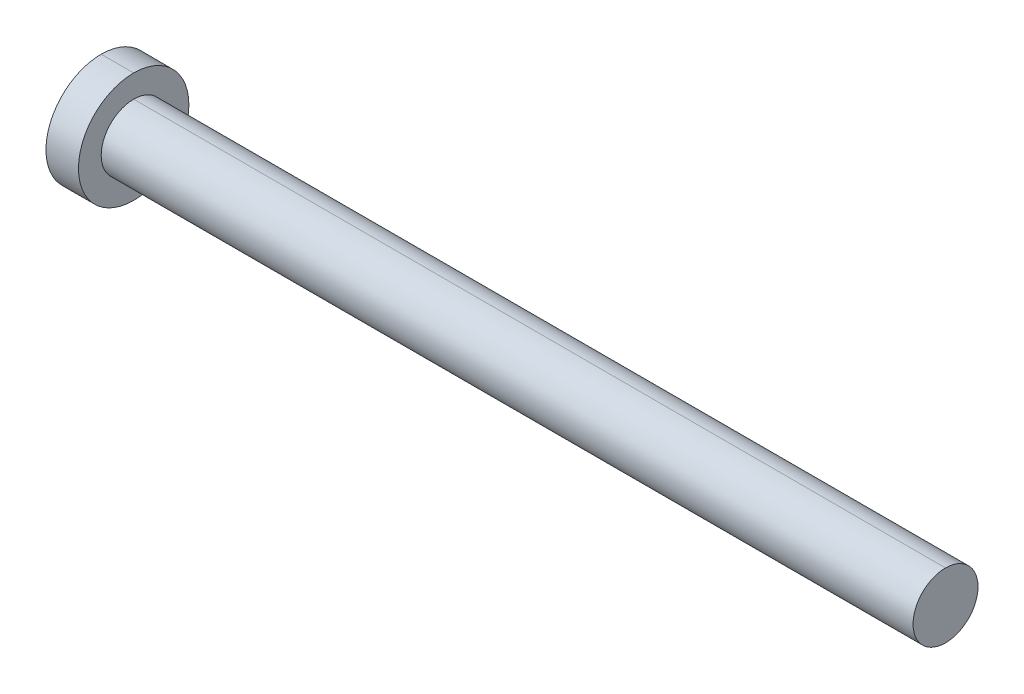
ISO-10303-21;
HEADER;
FILE_DESCRIPTION(('STEP AP214'),'2;1');
FILE_NAME('part.step','',(''),(''),'','','');
FILE_SCHEMA(('AUTOMOTIVE_DESIGN { 1 0 10303 214 1 1 1 1 }'));
ENDSEC;
DATA;
#1=APPLICATION_CONTEXT('core data for automotive mechanical design processes');
#2=APPLICATION_PROTOCOL_DEFINITION('international standard','automotive_design',2000,#1);
#3=PRODUCT_CONTEXT('',#1,'mechanical');
#4=PRODUCT('Part','Part','',(#3));
#5=PRODUCT_RELATED_PRODUCT_CATEGORY('part','',(#4));
#6=PRODUCT_DEFINITION_FORMATION('','',#4);
#7=PRODUCT_DEFINITION_CONTEXT('part definition',#1,'design');
#8=PRODUCT_DEFINITION('design','',#6,#7);
#9=PRODUCT_DEFINITION_SHAPE('','',#8);
#10=(LENGTH_UNIT() NAMED_UNIT(*) SI_UNIT(.MILLI.,.METRE.));
#11=(NAMED_UNIT(*) PLANE_ANGLE_UNIT() SI_UNIT($,.RADIAN.));
#12=(NAMED_UNIT(*) SI_UNIT($,.STERADIAN.) SOLID_ANGLE_UNIT());
#13=UNCERTAINTY_MEASURE_WITH_UNIT(LENGTH_MEASURE(1.E-05),#10,'distance_accuracy_value','');
#14=(GEOMETRIC_REPRESENTATION_CONTEXT(3) GLOBAL_UNCERTAINTY_ASSIGNED_CONTEXT((#13)) GLOBAL_UNIT_ASSIGNED_CONTEXT((#10,
#11,#12)) REPRESENTATION_CONTEXT('',''));
#15=CARTESIAN_POINT('',(0.,0.,0.));
#16=DIRECTION('',(0.,0.,1.));
#17=DIRECTION('',(1.,0.,0.));
#18=AXIS2_PLACEMENT_3D('',#15,#16,#17);
#19=CARTESIAN_POINT('',(26.5,0.,0.));
#20=DIRECTION('',(1.,0.,0.));
#21=DIRECTION('',(0.,1.,0.));
#22=AXIS2_PLACEMENT_3D('',#19,#20,#21);
#23=PLANE('',#22);
#24=CARTESIAN_POINT('',(26.5,0.,0.));
#25=DIRECTION('',(-1.,0.,0.));
#26=DIRECTION('',(0.,1.,0.));
#27=AXIS2_PLACEMENT_3D('',#24,#25,#26);
#28=CIRCLE('',#27,1.);
#29=CARTESIAN_POINT('',(26.5,1.,0.));
#30=VERTEX_POINT('',#29);
#31=CARTESIAN_POINT('',(26.5,-1.,0.));
#32=VERTEX_POINT('',#31);
#33=EDGE_CURVE('E11',#30,#32,#28,.T.);
#34=ORIENTED_EDGE('',*,*,#33,.F.);
#35=CARTESIAN_POINT('',(26.5,0.,0.));
#36=DIRECTION('',(-1.,0.,0.));
#37=DIRECTION('',(0.,-1.,0.));
#38=AXIS2_PLACEMENT_3D('',#35,#36,#37);
#39=CIRCLE('',#38,1.);
#40=EDGE_CURVE('E254',#32,#30,#39,.T.);
#41=ORIENTED_EDGE('',*,*,#40,.F.);
#42=EDGE_LOOP('',(#34,#41));
#43=FACE_BOUND('',#42,.T.);
#44=ADVANCED_FACE('F16',(#43),#23,.T.);
#45=CARTESIAN_POINT('',(1.5,0.,0.));
#46=DIRECTION('',(1.,0.,0.));
#47=DIRECTION('',(0.,1.,0.));
#48=AXIS2_PLACEMENT_3D('',#45,#46,#47);
#49=CYLINDRICAL_SURFACE('',#48,1.);
#50=DIRECTION('',(1.,0.,0.));
#51=VECTOR('',#50,1.);
#52=CARTESIAN_POINT('',(1.5,1.,0.));
#53=LINE('',#52,#51);
#54=CARTESIAN_POINT('',(1.5,1.,0.));
#55=VERTEX_POINT('',#54);
#56=EDGE_CURVE('E29',#55,#30,#53,.T.);
#57=ORIENTED_EDGE('',*,*,#56,.T.);
#58=ORIENTED_EDGE('',*,*,#33,.T.);
#59=DIRECTION('',(1.,0.,0.));
#60=VECTOR('',#59,1.);
#61=CARTESIAN_POINT('',(1.5,-1.,0.));
#62=LINE('',#61,#60);
#63=CARTESIAN_POINT('',(1.5,-1.,0.));
#64=VERTEX_POINT('',#63);
#65=EDGE_CURVE('E249',#64,#32,#62,.T.);
#66=ORIENTED_EDGE('',*,*,#65,.F.);
#67=CARTESIAN_POINT('',(1.5,0.,0.));
#68=DIRECTION('',(1.,0.,0.));
#69=DIRECTION('',(0.,-1.,0.));
#70=AXIS2_PLACEMENT_3D('',#67,#68,#69);
#71=CIRCLE('',#70,1.);
#72=EDGE_CURVE('E243',#64,#55,#71,.T.);
#73=ORIENTED_EDGE('',*,*,#72,.T.);
#74=EDGE_LOOP('',(#57,#58,#66,#73));
#75=FACE_BOUND('',#74,.T.);
#76=ADVANCED_FACE('F458',(#75),#49,.T.);
#77=CARTESIAN_POINT('',(1.5,0.,0.));
#78=DIRECTION('',(1.,0.,0.));
#79=DIRECTION('',(0.,1.,0.));
#80=AXIS2_PLACEMENT_3D('',#77,#78,#79);
#81=CYLINDRICAL_SURFACE('',#80,1.);
#82=ORIENTED_EDGE('',*,*,#65,.T.);
#83=ORIENTED_EDGE('',*,*,#40,.T.);
#84=ORIENTED_EDGE('',*,*,#56,.F.);
#85=CARTESIAN_POINT('',(1.5,0.,0.));
#86=DIRECTION('',(1.,0.,0.));
#87=DIRECTION('',(0.,1.,0.));
#88=AXIS2_PLACEMENT_3D('',#85,#86,#87);
#89=CIRCLE('',#88,1.);
#90=EDGE_CURVE('E238',#55,#64,#89,.T.);
#91=ORIENTED_EDGE('',*,*,#90,.T.);
#92=EDGE_LOOP('',(#82,#83,#84,#91));
#93=FACE_BOUND('',#92,.T.);
#94=ADVANCED_FACE('F469',(#93),#81,.T.);
#95=CARTESIAN_POINT('',(1.2,-0.095,-0.19));
#96=DIRECTION('',(0.535052081184326,0.,-0.844819075554241));
#97=DIRECTION('',(0.,-1.,0.));
#98=AXIS2_PLACEMENT_3D('',#95,#96,#97);
#99=PLANE('',#98);
#100=DIRECTION('',(0.,1.,0.));
#101=VECTOR('',#100,1.);
#102=CARTESIAN_POINT('',(1.2,-0.09500032662499,-0.19));
#103=LINE('',#102,#101);
#104=CARTESIAN_POINT('',(1.2,-0.09500032662499,-0.19));
#105=VERTEX_POINT('',#104);
#106=CARTESIAN_POINT('',(1.2,0.095000326625,-0.19));
#107=VERTEX_POINT('',#106);
#108=EDGE_CURVE('E233',#105,#107,#103,.T.);
#109=ORIENTED_EDGE('',*,*,#108,.T.);
#110=DIRECTION('',(-0.844818547946573,2.16301312484493E-06,-0.535052914243783));
#111=VECTOR('',#110,1.);
#112=CARTESIAN_POINT('',(1.2,0.095000326625,-0.19));
#113=LINE('',#112,#111);
#114=CARTESIAN_POINT('',(0.1791299170796,0.09500294038791,-0.836552462962));
#115=VERTEX_POINT('',#114);
#116=EDGE_CURVE('E246',#107,#115,#113,.T.);
#117=ORIENTED_EDGE('',*,*,#116,.T.);
#118=CARTESIAN_POINT('',(0.1791299170796,-0.09500294038791,-0.836552462962));
#119=CARTESIAN_POINT('',(0.1785473232444,-0.07389606735266,-0.8369214390576));
#120=CARTESIAN_POINT('',(0.1777684963023,-0.03167603195461,-0.8374128155266));
#121=CARTESIAN_POINT('',(0.1777684963023,0.03167603195484,-0.8374128155266));
#122=CARTESIAN_POINT('',(0.1785473232444,0.07389606735276,-0.8369214390576));
#123=CARTESIAN_POINT('',(0.1791299170796,0.09500294038791,-0.836552462962));
#124=(BOUNDED_CURVE() B_SPLINE_CURVE(3,(#118,#119,#120,#121,#122,#123),.UNSPECIFIED.,.F.,
.F.) B_SPLINE_CURVE_WITH_KNOTS((4,1,1,4),(0.,0.3333333333333,0.6666666666667,1.),
.UNSPECIFIED.) CURVE() GEOMETRIC_REPRESENTATION_ITEM() RATIONAL_B_SPLINE_CURVE((1.,1.,1.,1.,1.,1.)) REPRESENTATION_ITEM(''));
#125=CARTESIAN_POINT('',(0.1791299170796,-0.09500294038791,-0.836552462962));
#126=VERTEX_POINT('',#125);
#127=EDGE_CURVE('E262',#126,#115,#124,.T.);
#128=ORIENTED_EDGE('',*,*,#127,.F.);
#129=DIRECTION('',(0.844818547946573,2.16301312487893E-06,0.535052914243783));
#130=VECTOR('',#129,1.);
#131=CARTESIAN_POINT('',(0.1791299170796,-0.09500294038791,-0.836552462962));
#132=LINE('',#131,#130);
#133=EDGE_CURVE('E328',#126,#105,#132,.T.);
#134=ORIENTED_EDGE('',*,*,#133,.T.);
#135=EDGE_LOOP('',(#109,#117,#128,#134));
#136=FACE_BOUND('',#135,.T.);
#137=ADVANCED_FACE('F472',(#136),#99,.F.);
#138=CARTESIAN_POINT('',(1.5,0.095,0.));
#139=DIRECTION('',(0.,1.,0.));
#140=DIRECTION('',(1.,0.,0.));
#141=AXIS2_PLACEMENT_3D('',#138,#139,#140);
#142=PLANE('',#141);
#143=CARTESIAN_POINT('',(0.02018985212347,0.09499884995705,-0.09499848231229));
#144=CARTESIAN_POINT('',(0.02133659282814,0.09499884995705,-0.1050168379755));
#145=CARTESIAN_POINT('',(0.02389532158051,0.09500053373754,-0.1255498603069));
#146=CARTESIAN_POINT('',(0.02833030639071,0.09499985698304,-0.157275651823));
#147=CARTESIAN_POINT('',(0.03355158729956,0.0950000383303,-0.1916438748948));
#148=CARTESIAN_POINT('',(0.03974420586546,0.09499998969577,-0.2296994016848));
#149=CARTESIAN_POINT('',(0.04719536091092,0.09500000288662,-0.2727635876198));
#150=CARTESIAN_POINT('',(0.05608068914572,0.09499999875775,-0.3212108437261));
#151=CARTESIAN_POINT('',(0.06659497474856,0.0950000020824,-0.3753750213557));
#152=CARTESIAN_POINT('',(0.0789564518842,0.09499999291266,-0.4355404621176));
#153=CARTESIAN_POINT('',(0.09340022426379,0.09500002626695,-0.5019129045897));
#154=CARTESIAN_POINT('',(0.1102002196504,0.09499990201954,-0.5747189577292));
#155=CARTESIAN_POINT('',(0.1296969641062,0.09500036565488,-0.654291422456));
#156=CARTESIAN_POINT('',(0.1522854364773,0.09499863536093,-0.740983770677));
#157=CARTESIAN_POINT('',(0.1697450913098,0.09500294038791,-0.8038817509111));
#158=CARTESIAN_POINT('',(0.1791299170796,0.09500294038791,-0.836552462962));
#159=(BOUNDED_CURVE() B_SPLINE_CURVE(3,(#143,#144,#145,#146,#147,#148,#149,#150,#151,#152,#153,
#154,#155,#156,#157,#158),.UNSPECIFIED.,.F.,.F.) B_SPLINE_CURVE_WITH_KNOTS((4,1,1,1,1,1,1,1,1,1,
1,1,1,4),(0.,0.07692307692308,0.1538461538462,0.2307692307692,0.3076923076923,0.3846153846154,
0.4615384615385,0.5384615384615,0.6153846153846,0.6923076923077,0.7692307692308,0.8461538461538,
0.9230769230769,1.),
.UNSPECIFIED.) CURVE() GEOMETRIC_REPRESENTATION_ITEM() RATIONAL_B_SPLINE_CURVE((1.,1.,1.,1.,1.,
1.,1.,1.,1.,1.,1.,1.,1.,1.,1.,1.)) REPRESENTATION_ITEM(''));
#160=CARTESIAN_POINT('',(0.02018985212347,0.09499884995705,-0.09499848231229));
#161=VERTEX_POINT('',#160);
#162=EDGE_CURVE('E255',#161,#115,#159,.T.);
#163=ORIENTED_EDGE('',*,*,#162,.T.);
#164=ORIENTED_EDGE('',*,*,#116,.F.);
#165=DIRECTION('',(0.,4.78395807622779E-06,-0.999999999988557));
#166=VECTOR('',#165,1.);
#167=CARTESIAN_POINT('',(1.2,0.09499987214817,-0.0949998313293));
#168=LINE('',#167,#166);
#169=CARTESIAN_POINT('',(1.2,0.09499987214817,-0.0949998313293));
#170=VERTEX_POINT('',#169);
#171=EDGE_CURVE('E209',#170,#107,#168,.T.);
#172=ORIENTED_EDGE('',*,*,#171,.F.);
#173=DIRECTION('',(0.999999999998971,8.66403055262275E-07,-1.14341872053997E-06));
#174=VECTOR('',#173,1.);
#175=CARTESIAN_POINT('',(0.02018985212347,0.09499884995705,-0.09499848231229));
#176=LINE('',#175,#174);
#177=EDGE_CURVE('E250',#161,#170,#176,.T.);
#178=ORIENTED_EDGE('',*,*,#177,.F.);
#179=EDGE_LOOP('',(#163,#164,#172,#178));
#180=FACE_BOUND('',#179,.T.);
#181=ADVANCED_FACE('F476',(#180),#142,.F.);
#182=CARTESIAN_POINT('',(1.5,0.,-0.095));
#183=DIRECTION('',(0.,0.,1.));
#184=DIRECTION('',(1.,0.,0.));
#185=AXIS2_PLACEMENT_3D('',#182,#183,#184);
#186=PLANE('',#185);
#187=DIRECTION('',(0.,0.999999999954052,-9.58620292593554E-06));
#188=VECTOR('',#187,1.);
#189=CARTESIAN_POINT('',(1.2,0.09499987214817,-0.0949998313293));
#190=LINE('',#189,#188);
#191=CARTESIAN_POINT('',(1.2,0.19,-0.0950007420198));
#192=VERTEX_POINT('',#191);
#193=EDGE_CURVE('E202',#170,#192,#190,.T.);
#194=ORIENTED_EDGE('',*,*,#193,.T.);
#195=DIRECTION('',(0.844820605144228,-0.535049666012018,4.91626114623916E-06));
#196=VECTOR('',#195,1.);
#197=CARTESIAN_POINT('',(0.1791289512878,0.8365475751051,-0.09500668277059));
#198=LINE('',#197,#196);
#199=CARTESIAN_POINT('',(0.1791289512878,0.8365475751051,-0.09500668277059));
#200=VERTEX_POINT('',#199);
#201=EDGE_CURVE('E199',#200,#192,#198,.T.);
#202=ORIENTED_EDGE('',*,*,#201,.F.);
#203=CARTESIAN_POINT('',(0.1791289512878,0.8365475751051,-0.09500668277059));
#204=CARTESIAN_POINT('',(0.1703519842986,0.8059927100232,-0.09500668277059));
#205=CARTESIAN_POINT('',(0.153951114102,0.7470480403839,-0.09499689851548));
#206=CARTESIAN_POINT('',(0.1325414176951,0.6654011121539,-0.09500083103994));
#207=CARTESIAN_POINT('',(0.1138829895667,0.5900273596821,-0.09499977732477));
#208=CARTESIAN_POINT('',(0.09763627594721,0.5205941638869,-0.09500005966099));
#209=CARTESIAN_POINT('',(0.08351692921581,0.456837302995,-0.09499998403126));
#210=CARTESIAN_POINT('',(0.07129144644189,0.3985679309905,-0.09500000421398));
#211=CARTESIAN_POINT('',(0.06076557801334,0.3456592310444,-0.09499999911283));
#212=CARTESIAN_POINT('',(0.05173134765559,0.2977836011974,-0.09499999933469));
#213=CARTESIAN_POINT('',(0.04401651450985,0.254651343066,-0.09500000354841));
#214=CARTESIAN_POINT('',(0.0374908690331,0.2160767233234,-0.09499998647166));
#215=CARTESIAN_POINT('',(0.03205143876126,0.1819604103823,-0.09500005056495));
#216=CARTESIAN_POINT('',(0.02745358732374,0.1511466878604,-0.09499981126855));
#217=CARTESIAN_POINT('',(0.02352410040327,0.1226300118764,-0.09500070436086));
#218=CARTESIAN_POINT('',(0.02122868413253,0.1040743812279,-0.09499848231229));
#219=CARTESIAN_POINT('',(0.02018985212347,0.09499884995705,-0.09499848231229));
#220=(BOUNDED_CURVE() B_SPLINE_CURVE(3,(#203,#204,#205,#206,#207,#208,#209,#210,#211,#212,#213,
#214,#215,#216,#217,#218,#219),.UNSPECIFIED.,.F.,.F.) B_SPLINE_CURVE_WITH_KNOTS((4,1,1,1,1,1,1,
1,1,1,1,1,1,1,4),(0.,0.07142857142857,0.1428571428571,0.2142857142857,0.2857142857143,
0.3571428571429,0.4285714285714,0.5,0.5714285714286,0.6428571428571,0.7142857142857,
0.7857142857143,0.8571428571429,0.9285714285714,1.),
.UNSPECIFIED.) CURVE() GEOMETRIC_REPRESENTATION_ITEM() RATIONAL_B_SPLINE_CURVE((1.,1.,1.,1.,1.,
1.,1.,1.,1.,1.,1.,1.,1.,1.,1.,1.,1.)) REPRESENTATION_ITEM(''));
#221=EDGE_CURVE('E261',#200,#161,#220,.T.);
#222=ORIENTED_EDGE('',*,*,#221,.T.);
#223=ORIENTED_EDGE('',*,*,#177,.T.);
#224=EDGE_LOOP('',(#194,#202,#222,#223));
#225=FACE_BOUND('',#224,.T.);
#226=ADVANCED_FACE('F514',(#225),#186,.T.);
#227=CARTESIAN_POINT('',(1.2,0.19,-0.095));
#228=DIRECTION('',(0.535052081184326,0.844819075554241,0.));
#229=DIRECTION('',(0.,0.,-1.));
#230=AXIS2_PLACEMENT_3D('',#227,#228,#229);
#231=PLANE('',#230);
#232=DIRECTION('',(0.,0.,1.));
#233=VECTOR('',#232,1.);
#234=CARTESIAN_POINT('',(1.2,0.19,-0.0950007420198));
#235=LINE('',#234,#233);
#236=CARTESIAN_POINT('',(1.2,0.19,0.09500074203621));
#237=VERTEX_POINT('',#236);
#238=EDGE_CURVE('E191',#192,#237,#235,.T.);
#239=ORIENTED_EDGE('',*,*,#238,.T.);
#240=DIRECTION('',(-0.844820602284385,0.53504967052759,4.91594681516191E-06));
#241=VECTOR('',#240,1.);
#242=CARTESIAN_POINT('',(1.2,0.19,0.09500074203621));
#243=LINE('',#242,#241);
#244=CARTESIAN_POINT('',(0.1791289670399,0.8365475727741,0.09500668240709));
#245=VERTEX_POINT('',#244);
#246=EDGE_CURVE('E174',#237,#245,#243,.T.);
#247=ORIENTED_EDGE('',*,*,#246,.T.);
#248=CARTESIAN_POINT('',(0.177816342544,0.8373784759428,-1.761038213236E-06));
#249=CARTESIAN_POINT('',(0.1778163584407,0.8373784658749,0.01056216246066));
#250=CARTESIAN_POINT('',(0.1779151673113,0.8373219531642,0.03167312553222));
#251=CARTESIAN_POINT('',(0.1783523564091,0.8370448113284,0.0633432327491));
#252=CARTESIAN_POINT('',(0.1788376907368,0.836732047766,0.0844551717095));
#253=CARTESIAN_POINT('',(0.1791289670399,0.8365475727741,0.09500668240709));
#254=(BOUNDED_CURVE() B_SPLINE_CURVE(3,(#248,#249,#250,#251,#252,#253),.UNSPECIFIED.,.F.,
.F.) B_SPLINE_CURVE_WITH_KNOTS((4,1,1,4),(0.,0.3333333333333,0.6666666666667,1.),
.UNSPECIFIED.) CURVE() GEOMETRIC_REPRESENTATION_ITEM() RATIONAL_B_SPLINE_CURVE((1.,1.,1.,1.,1.,1.)) REPRESENTATION_ITEM(''));
#255=CARTESIAN_POINT('',(0.1778154822134,0.8373761575729,3.504032847994E-08));
#256=VERTEX_POINT('',#255);
#257=EDGE_CURVE('E313',#256,#245,#254,.T.);
#258=ORIENTED_EDGE('',*,*,#257,.F.);
#259=CARTESIAN_POINT('',(0.1791289512878,0.8365475751051,-0.09500668277059));
#260=CARTESIAN_POINT('',(0.178837669834,0.8367320533591,-0.0844549856762));
#261=CARTESIAN_POINT('',(0.1783524984071,0.8370447249641,-0.0633418462407));
#262=CARTESIAN_POINT('',(0.1779152817568,0.8373218796627,-0.03167484294298));
#263=CARTESIAN_POINT('',(0.1778163424364,0.837378476011,-0.01055453399456));
#264=CARTESIAN_POINT('',(0.177816342544,0.8373784759428,-1.761038213236E-06));
#265=(BOUNDED_CURVE() B_SPLINE_CURVE(3,(#259,#260,#261,#262,#263,#264),.UNSPECIFIED.,.F.,
.F.) B_SPLINE_CURVE_WITH_KNOTS((4,1,1,4),(0.,0.3333333333333,0.6666666666667,1.),
.UNSPECIFIED.) CURVE() GEOMETRIC_REPRESENTATION_ITEM() RATIONAL_B_SPLINE_CURVE((1.,1.,1.,1.,1.,1.)) REPRESENTATION_ITEM(''));
#266=EDGE_CURVE('E288',#200,#256,#265,.T.);
#267=ORIENTED_EDGE('',*,*,#266,.F.);
#268=ORIENTED_EDGE('',*,*,#201,.T.);
#269=EDGE_LOOP('',(#239,#247,#258,#267,#268));
#270=FACE_BOUND('',#269,.T.);
#271=ADVANCED_FACE('F197',(#270),#231,.F.);
#272=CARTESIAN_POINT('',(0.,-0.095,0.95));
#273=DIRECTION('',(0.535052081184326,0.,0.844819075554241));
#274=DIRECTION('',(0.,-1.,0.));
#275=AXIS2_PLACEMENT_3D('',#272,#273,#274);
#276=PLANE('',#275);
#277=CARTESIAN_POINT('',(0.1791299170796,0.09500294038791,0.836552462962));
#278=CARTESIAN_POINT('',(0.1785473232444,0.07389606735267,0.8369214390576));
#279=CARTESIAN_POINT('',(0.1777684963023,0.03167603195463,0.8374128155266));
#280=CARTESIAN_POINT('',(0.1777684963023,-0.03167603195481,0.8374128155266));
#281=CARTESIAN_POINT('',(0.1785473232444,-0.07389606735275,0.8369214390576));
#282=CARTESIAN_POINT('',(0.1791299170796,-0.09500294038791,0.836552462962));
#283=(BOUNDED_CURVE() B_SPLINE_CURVE(3,(#277,#278,#279,#280,#281,#282),.UNSPECIFIED.,.F.,
.F.) B_SPLINE_CURVE_WITH_KNOTS((4,1,1,4),(0.,0.3333333333333,0.6666666666667,1.),
.UNSPECIFIED.) CURVE() GEOMETRIC_REPRESENTATION_ITEM() RATIONAL_B_SPLINE_CURVE((1.,1.,1.,1.,1.,1.)) REPRESENTATION_ITEM(''));
#284=CARTESIAN_POINT('',(0.1791299170796,0.09500294038791,0.836552462962));
#285=VERTEX_POINT('',#284);
#286=CARTESIAN_POINT('',(0.1791299170796,-0.09500294038791,0.836552462962));
#287=VERTEX_POINT('',#286);
#288=EDGE_CURVE('E318',#285,#287,#283,.T.);
#289=ORIENTED_EDGE('',*,*,#288,.F.);
#290=DIRECTION('',(0.844818547946573,-2.16301312480993E-06,-0.535052914243783));
#291=VECTOR('',#290,1.);
#292=CARTESIAN_POINT('',(0.1791299170796,0.09500294038791,0.836552462962));
#293=LINE('',#292,#291);
#294=CARTESIAN_POINT('',(1.2,0.09500032662499,0.19));
#295=VERTEX_POINT('',#294);
#296=EDGE_CURVE('E334',#285,#295,#293,.T.);
#297=ORIENTED_EDGE('',*,*,#296,.T.);
#298=DIRECTION('',(0.,1.,0.));
#299=VECTOR('',#298,1.);
#300=CARTESIAN_POINT('',(1.2,-0.095000326625,0.19));
#301=LINE('',#300,#299);
#302=CARTESIAN_POINT('',(1.2,-0.095000326625,0.19));
#303=VERTEX_POINT('',#302);
#304=EDGE_CURVE('E270',#303,#295,#301,.T.);
#305=ORIENTED_EDGE('',*,*,#304,.F.);
#306=DIRECTION('',(-0.844818547946573,-2.16301312485593E-06,0.535052914243783));
#307=VECTOR('',#306,1.);
#308=CARTESIAN_POINT('',(1.2,-0.095000326625,0.19));
#309=LINE('',#308,#307);
#310=EDGE_CURVE('E301',#303,#287,#309,.T.);
#311=ORIENTED_EDGE('',*,*,#310,.T.);
#312=EDGE_LOOP('',(#289,#297,#305,#311));
#313=FACE_BOUND('',#312,.T.);
#314=ADVANCED_FACE('F513',(#313),#276,.F.);
#315=CARTESIAN_POINT('',(0.,-0.95,-0.095));
#316=DIRECTION('',(0.535052081184326,-0.844819075554241,0.));
#317=DIRECTION('',(0.,0.,-1.));
#318=AXIS2_PLACEMENT_3D('',#315,#316,#317);
#319=PLANE('',#318);
#320=CARTESIAN_POINT('',(0.1778163392622,-0.8373784959777,7.077731531413E-08));
#321=CARTESIAN_POINT('',(0.1778163630757,-0.8373784808958,-0.01056360562502));
#322=CARTESIAN_POINT('',(0.1779151893053,-0.8373219309903,-0.03167523558462));
#323=CARTESIAN_POINT('',(0.1783523904444,-0.8370447916933,-0.06334397717664));
#324=CARTESIAN_POINT('',(0.1788376931085,-0.8367320472789,-0.084455457632));
#325=CARTESIAN_POINT('',(0.1791289615147,-0.8365475772883,-0.09500668231145));
#326=(BOUNDED_CURVE() B_SPLINE_CURVE(3,(#320,#321,#322,#323,#324,#325),.UNSPECIFIED.,.F.,
.F.) B_SPLINE_CURVE_WITH_KNOTS((4,1,1,4),(0.,0.3333333333333,0.6666666666667,1.),
.UNSPECIFIED.) CURVE() GEOMETRIC_REPRESENTATION_ITEM() RATIONAL_B_SPLINE_CURVE((1.,1.,1.,1.,1.,1.)) REPRESENTATION_ITEM(''));
#327=CARTESIAN_POINT('',(0.1778163392622,-0.8373784959777,7.077731531413E-08));
#328=VERTEX_POINT('',#327);
#329=CARTESIAN_POINT('',(0.1791289615147,-0.8365475772883,-0.09500668231145));
#330=VERTEX_POINT('',#329);
#331=EDGE_CURVE('E216',#328,#330,#326,.T.);
#332=ORIENTED_EDGE('',*,*,#331,.F.);
#333=CARTESIAN_POINT('',(0.1791289321105,-0.8365475992774,0.09500668244312));
#334=CARTESIAN_POINT('',(0.1788376427781,-0.8367320825212,0.08445469969631));
#335=CARTESIAN_POINT('',(0.1783524911327,-0.837044726353,0.06334109996352));
#336=CARTESIAN_POINT('',(0.177915269136,-0.8373218808798,0.03167273222919));
#337=CARTESIAN_POINT('',(0.1778163391546,-0.8373784960458,0.0105530905151));
#338=CARTESIAN_POINT('',(0.1778163392622,-0.8373784959777,7.077731531413E-08));
#339=(BOUNDED_CURVE() B_SPLINE_CURVE(3,(#333,#334,#335,#336,#337,#338),.UNSPECIFIED.,.F.,
.F.) B_SPLINE_CURVE_WITH_KNOTS((4,1,1,4),(0.,0.3333333333333,0.6666666666667,1.),
.UNSPECIFIED.) CURVE() GEOMETRIC_REPRESENTATION_ITEM() RATIONAL_B_SPLINE_CURVE((1.,1.,1.,1.,1.,1.)) REPRESENTATION_ITEM(''));
#340=CARTESIAN_POINT('',(0.1791289321105,-0.8365475992774,0.09500668244312));
#341=VERTEX_POINT('',#340);
#342=EDGE_CURVE('E227',#341,#328,#339,.T.);
#343=ORIENTED_EDGE('',*,*,#342,.F.);
#344=DIRECTION('',(0.84482060064539,0.535049673115493,-4.91597646199794E-06));
#345=VECTOR('',#344,1.);
#346=CARTESIAN_POINT('',(0.1791289321105,-0.8365475992774,0.09500668244312));
#347=LINE('',#346,#345);
#348=CARTESIAN_POINT('',(1.2,-0.19,0.09500074203621));
#349=VERTEX_POINT('',#348);
#350=EDGE_CURVE('E310',#341,#349,#347,.T.);
#351=ORIENTED_EDGE('',*,*,#350,.T.);
#352=DIRECTION('',(0.,0.,1.));
#353=VECTOR('',#352,1.);
#354=CARTESIAN_POINT('',(1.2,-0.19,-0.09500074203621));
#355=LINE('',#354,#353);
#356=CARTESIAN_POINT('',(1.2,-0.19,-0.09500074203621));
#357=VERTEX_POINT('',#356);
#358=EDGE_CURVE('E237',#357,#349,#355,.T.);
#359=ORIENTED_EDGE('',*,*,#358,.F.);
#360=DIRECTION('',(-0.844820601904699,-0.535049671127099,-4.91586764306199E-06));
#361=VECTOR('',#360,1.);
#362=CARTESIAN_POINT('',(1.2,-0.19,-0.09500074203621));
#363=LINE('',#362,#361);
#364=EDGE_CURVE('E212',#357,#330,#363,.T.);
#365=ORIENTED_EDGE('',*,*,#364,.T.);
#366=EDGE_LOOP('',(#332,#343,#351,#359,#365));
#367=FACE_BOUND('',#366,.T.);
#368=ADVANCED_FACE('F18',(#367),#319,.F.);
#369=CARTESIAN_POINT('',(1.5,0.,0.095));
#370=DIRECTION('',(0.,0.,1.));
#371=DIRECTION('',(1.,0.,0.));
#372=AXIS2_PLACEMENT_3D('',#369,#370,#371);
#373=PLANE('',#372);
#374=DIRECTION('',(0.,0.999999999954051,-9.58637558510252E-06));
#375=VECTOR('',#374,1.);
#376=CARTESIAN_POINT('',(1.2,-0.19,0.09500074203621));
#377=LINE('',#376,#375);
#378=CARTESIAN_POINT('',(1.2,-0.09499987214817,0.0949998313293));
#379=VERTEX_POINT('',#378);
#380=EDGE_CURVE('E271',#349,#379,#377,.T.);
#381=ORIENTED_EDGE('',*,*,#380,.F.);
#382=ORIENTED_EDGE('',*,*,#350,.F.);
#383=CARTESIAN_POINT('',(0.1791289321105,-0.8365475992774,0.09500668244312));
#384=CARTESIAN_POINT('',(0.1703519626726,-0.8059927260852,0.09500668244312));
#385=CARTESIAN_POINT('',(0.1539511249004,-0.7470480359744,0.09499689866746));
#386=CARTESIAN_POINT('',(0.1325414095252,-0.6654010930911,0.09500083099922));
#387=CARTESIAN_POINT('',(0.1138829819054,-0.5900273245722,0.09499977733568));
#388=CARTESIAN_POINT('',(0.0976362643526,-0.5205941142596,0.09500005965807));
#389=CARTESIAN_POINT('',(0.0835169156446,-0.4568372400634,0.09499998403204));
#390=CARTESIAN_POINT('',(0.07129143059567,-0.3985678538018,0.09500000421377));
#391=CARTESIAN_POINT('',(0.06076556104032,-0.3456591437272,0.09499999911289));
#392=CARTESIAN_POINT('',(0.05173132904044,-0.2977835002775,0.09499999933467));
#393=CARTESIAN_POINT('',(0.04401649490685,-0.254651230733,0.09500000354842));
#394=CARTESIAN_POINT('',(0.03749085010204,-0.2160766082664,0.09499998647166));
#395=CARTESIAN_POINT('',(0.03205142232375,-0.1819603038804,0.09500005056495));
#396=CARTESIAN_POINT('',(0.02745357455937,-0.1511465986085,0.09499981126855));
#397=CARTESIAN_POINT('',(0.02352409312111,-0.1226299550041,0.09500070436086));
#398=CARTESIAN_POINT('',(0.02122868171541,-0.1040743601113,0.09499848231229));
#399=CARTESIAN_POINT('',(0.02018985212346,-0.09499884995705,0.09499848231229));
#400=(BOUNDED_CURVE() B_SPLINE_CURVE(3,(#383,#384,#385,#386,#387,#388,#389,#390,#391,#392,#393,
#394,#395,#396,#397,#398,#399),.UNSPECIFIED.,.F.,.F.) B_SPLINE_CURVE_WITH_KNOTS((4,1,1,1,1,1,1,
1,1,1,1,1,1,1,4),(0.,0.07142857142857,0.1428571428571,0.2142857142857,0.2857142857143,
0.3571428571429,0.4285714285714,0.5,0.5714285714286,0.6428571428571,0.7142857142857,
0.7857142857143,0.8571428571429,0.9285714285714,1.),
.UNSPECIFIED.) CURVE() GEOMETRIC_REPRESENTATION_ITEM() RATIONAL_B_SPLINE_CURVE((1.,1.,1.,1.,1.,
1.,1.,1.,1.,1.,1.,1.,1.,1.,1.,1.,1.)) REPRESENTATION_ITEM(''));
#401=CARTESIAN_POINT('',(0.02018985212346,-0.09499884995705,0.09499848231229));
#402=VERTEX_POINT('',#401);
#403=EDGE_CURVE('E222',#341,#402,#400,.T.);
#404=ORIENTED_EDGE('',*,*,#403,.T.);
#405=DIRECTION('',(0.999999999998971,-8.66403055168175E-07,1.14341872044597E-06));
#406=VECTOR('',#405,1.);
#407=CARTESIAN_POINT('',(0.02018985212346,-0.09499884995705,0.09499848231229));
#408=LINE('',#407,#406);
#409=EDGE_CURVE('E304',#402,#379,#408,.T.);
#410=ORIENTED_EDGE('',*,*,#409,.T.);
#411=EDGE_LOOP('',(#381,#382,#404,#410));
#412=FACE_BOUND('',#411,.T.);
#413=ADVANCED_FACE('F541',(#412),#373,.F.);
#414=CARTESIAN_POINT('',(1.5,-0.095,0.));
#415=DIRECTION('',(0.,1.,0.));
#416=DIRECTION('',(1.,0.,0.));
#417=AXIS2_PLACEMENT_3D('',#414,#415,#416);
#418=PLANE('',#417);
#419=CARTESIAN_POINT('',(0.02018985212346,-0.09499884995705,0.09499848231229));
#420=CARTESIAN_POINT('',(0.02133658553191,-0.09499884995705,0.1050167742329));
#421=CARTESIAN_POINT('',(0.02389530101028,-0.09500053373754,0.1255497031043));
#422=CARTESIAN_POINT('',(0.02833028077981,-0.09499985698304,0.1572754775111));
#423=CARTESIAN_POINT('',(0.03355156586212,-0.0950000383303,0.1916437404073));
#424=CARTESIAN_POINT('',(0.03974419422132,-0.09499998969577,0.2296993335171));
#425=CARTESIAN_POINT('',(0.04719535035951,-0.09500000288662,0.2727635276265));
#426=CARTESIAN_POINT('',(0.05608066281749,-0.09499999875775,0.321210702746));
#427=CARTESIAN_POINT('',(0.06659493483573,-0.0950000020824,0.3753748213065));
#428=CARTESIAN_POINT('',(0.07895641165491,-0.09499999291266,0.4355402727365));
#429=CARTESIAN_POINT('',(0.09340019259802,-0.09500002626695,0.5019127646361));
#430=CARTESIAN_POINT('',(0.1102002029328,-0.09499990201954,0.5747188890213));
#431=CARTESIAN_POINT('',(0.1296969655067,-0.09500036565488,0.6542914294515));
#432=CARTESIAN_POINT('',(0.1522854506287,-0.09499863536093,0.7409838233969));
#433=CARTESIAN_POINT('',(0.1697450984898,-0.09500294038791,0.8038817759064));
#434=CARTESIAN_POINT('',(0.1791299170796,-0.09500294038791,0.836552462962));
#435=(BOUNDED_CURVE() B_SPLINE_CURVE(3,(#419,#420,#421,#422,#423,#424,#425,#426,#427,#428,#429,
#430,#431,#432,#433,#434),.UNSPECIFIED.,.F.,.F.) B_SPLINE_CURVE_WITH_KNOTS((4,1,1,1,1,1,1,1,1,1,
1,1,1,4),(0.,0.07692307692308,0.1538461538462,0.2307692307692,0.3076923076923,0.3846153846154,
0.4615384615385,0.5384615384615,0.6153846153846,0.6923076923077,0.7692307692308,0.8461538461538,
0.9230769230769,1.),
.UNSPECIFIED.) CURVE() GEOMETRIC_REPRESENTATION_ITEM() RATIONAL_B_SPLINE_CURVE((1.,1.,1.,1.,1.,
1.,1.,1.,1.,1.,1.,1.,1.,1.,1.,1.)) REPRESENTATION_ITEM(''));
#436=EDGE_CURVE('E305',#402,#287,#435,.T.);
#437=ORIENTED_EDGE('',*,*,#436,.T.);
#438=ORIENTED_EDGE('',*,*,#310,.F.);
#439=DIRECTION('',(0.,4.78395807681179E-06,-0.999999999988557));
#440=VECTOR('',#439,1.);
#441=CARTESIAN_POINT('',(1.2,-0.095000326625,0.19));
#442=LINE('',#441,#440);
#443=EDGE_CURVE('E263',#303,#379,#442,.T.);
#444=ORIENTED_EDGE('',*,*,#443,.T.);
#445=ORIENTED_EDGE('',*,*,#409,.F.);
#446=EDGE_LOOP('',(#437,#438,#444,#445));
#447=FACE_BOUND('',#446,.T.);
#448=ADVANCED_FACE('F523',(#447),#418,.T.);
#449=CARTESIAN_POINT('',(0.5139015559222,-1.680018242652,-0.4118364687427));
#450=CARTESIAN_POINT('',(0.2706641740786,-1.177862272655,-0.2887389117097));
#451=CARTESIAN_POINT('',(0.1032439952811,-0.6472676962323,-0.1586699689206));
#452=CARTESIAN_POINT('',(0.01502841787069,-0.0989699886454101,-0.02426131431221));
#453=CARTESIAN_POINT('',(0.5139015559223,-1.970051266824,0.7713049200425));
#454=CARTESIAN_POINT('',(0.2706641740787,-1.381204681877,0.5407625601717));
#455=CARTESIAN_POINT('',(0.1032439952811,-0.7590099396325,0.2971638914471));
#456=CARTESIAN_POINT('',(0.01502841787069,-0.1160558537749,0.04543762516428));
#457=CARTESIAN_POINT('',(0.5139015559223,-1.218177676989,1.729756173824));
#458=CARTESIAN_POINT('',(0.2706641740787,-0.8540654444628,1.212733580098));
#459=CARTESIAN_POINT('',(0.1032439952811,-0.4693324385226,0.666430438224));
#460=CARTESIAN_POINT('',(0.01502841787069,-0.07176292959139,0.101900053545));
#461=CARTESIAN_POINT('',(0.5139015559223,-5.808593163726E-06,1.729760264486));
#462=CARTESIAN_POINT('',(0.2706641740787,-4.072409796078E-06,1.212736448064));
#463=CARTESIAN_POINT('',(0.1032439952811,-2.237901127832E-06,0.666432014250601));
#464=CARTESIAN_POINT('',(0.01502841787069,-3.421846180549E-07,0.1019002945261));
#465=CARTESIAN_POINT('',(0.5139015559223,1.218166059802,1.729764355148));
#466=CARTESIAN_POINT('',(0.2706641740787,0.854057299643301,1.212739316031));
#467=CARTESIAN_POINT('',(0.1032439952811,0.4693279627203,0.6664335902772));
#468=CARTESIAN_POINT('',(0.01502841787069,0.07176224522215,0.1019005355073));
#469=CARTESIAN_POINT('',(0.513901555922201,1.970046086644,0.771318151022));
#470=CARTESIAN_POINT('',(0.2706641740786,1.381201050048,0.5407718364232));
#471=CARTESIAN_POINT('',(0.1032439952811,0.759007943842699,0.2971689890023));
#472=CARTESIAN_POINT('',(0.01502841787069,0.1160555486102,0.04543840460218));
#473=CARTESIAN_POINT('',(0.5139015559222,1.680021008535,-0.4118251856178));
#474=CARTESIAN_POINT('',(0.2706641740786,1.177864211819,-0.2887310011009));
#475=CARTESIAN_POINT('',(0.103243995281,0.6472687618559,-0.1586656218236));
#476=CARTESIAN_POINT('',(0.01502841787068,0.0989701515838,-0.02426064962256));
#477=(BOUNDED_SURFACE() B_SPLINE_SURFACE(3,3,((#449,#450,#451,#452),(#453,#454,#455,#456),(#457,
#458,#459,#460),(#461,#462,#463,#464),(#465,#466,#467,#468),(#469,#470,#471,#472),(#473,#474,
#475,#476)),.UNSPECIFIED.,.F.,.F.,.F.) B_SPLINE_SURFACE_WITH_KNOTS((4,3,4),(4,4),(0.,1.,2.),(0.,
1.),.UNSPECIFIED.) GEOMETRIC_REPRESENTATION_ITEM() RATIONAL_B_SPLINE_SURFACE(((1.242979426046,
1.234596393454,1.234596393454,1.242979426046),(0.9257854508467,0.9195416712279,0.9195416712279,
0.9257854508467),(0.9257854508467,0.9195416712279,0.9195416712279,0.9257854508467),
(1.242979426046,1.234596393454,1.234596393454,1.242979426046),(0.9257854508467,0.9195416712279,
0.9195416712279,0.9257854508467),(0.9257854508467,0.9195416712279,0.9195416712279,
0.9257854508467),(1.242979426046,1.234596393454,1.234596393454,1.242979426046))) REPRESENTATION_ITEM('') SURFACE());
#478=CARTESIAN_POINT('',(5.943088613548,0.8244378275144,3.449864690696E-08));
#479=DIRECTION('',(0.,4.18453852679685E-08,-1.));
#480=DIRECTION('',(-0.907182989464776,-0.420736287507689,-1.76058293980895E-08));
#481=AXIS2_PLACEMENT_3D('',#478,#479,#480);
#482=CIRCLE('',#481,5.999999999993);
#483=CARTESIAN_POINT('',(0.4999935794621,-1.699991247707,-2.209386118189E-06));
#484=VERTEX_POINT('',#483);
#485=EDGE_CURVE('E420',#484,#328,#482,.T.);
#486=CARTESIAN_POINT('',(0.499990555696172,-1.65109400420815,-0.404746036079917));
#487=CARTESIAN_POINT('',(0.499990555696263,-1.93613363953787,0.75802565505964));
#488=CARTESIAN_POINT('',(0.499990555696263,-1.19720477282542,1.6999756162377));
#489=CARTESIAN_POINT('',(0.499990555696272,-5.70858881306627E-06,1.6999796364723));
#490=CARTESIAN_POINT('',(0.499990555696263,1.19719335564716,1.69998365670692));
#491=CARTESIAN_POINT('',(0.499990555696164,1.93612854854305,0.758038658246377));
#492=CARTESIAN_POINT('',(0.499990555696172,1.65109672247204,-0.404734947212311));
#493=(BOUNDED_CURVE() B_SPLINE_CURVE(3,(#486,#487,#488,#489,#490,#491,#492),.UNSPECIFIED.,.F.,
.F.) B_SPLINE_CURVE_WITH_KNOTS((4,3,4),(0.,1.,2.),
.UNSPECIFIED.) CURVE() GEOMETRIC_REPRESENTATION_ITEM() RATIONAL_B_SPLINE_CURVE((1.24250337022227,
0.925430878963913,0.925430878963913,1.24250337022227,0.925430878963913,0.925430878963913,1.24250337022227)) REPRESENTATION_ITEM(''));
#494=CARTESIAN_POINT('',(0.4999935794621,1.699991247707,2.209386121978E-06));
#495=VERTEX_POINT('',#494);
#496=EDGE_CURVE('E242',#495,#484,#493,.F.);
#497=CARTESIAN_POINT('',(5.943088613548,-0.8244378275144,-3.449864688408E-08));
#498=DIRECTION('',(0.,-4.18453852402083E-08,1.));
#499=DIRECTION('',(-0.907182989464776,0.420736287507689,1.76058293864096E-08));
#500=AXIS2_PLACEMENT_3D('',#497,#498,#499);
#501=CIRCLE('',#500,5.999999999993);
#502=EDGE_CURVE('E296',#495,#256,#501,.T.);
#503=CARTESIAN_POINT('',(0.02018985211436,0.09499884995705,0.09499848231229));
#504=CARTESIAN_POINT('',(0.02126348620388,0.1043784220804,0.09499848231229));
#505=CARTESIAN_POINT('',(0.02363187360879,0.1234742044513,0.09500070436086));
#506=CARTESIAN_POINT('',(0.02766662873339,0.1526370620615,0.09499981126855));
#507=CARTESIAN_POINT('',(0.03233935819486,0.1838216616117,0.09500005056495));
#508=CARTESIAN_POINT('',(0.03779465049723,0.2179140681291,0.09499998647166));
#509=CARTESIAN_POINT('',(0.04426862309979,0.256089311631,0.09500000354842));
#510=CARTESIAN_POINT('',(0.05194285129111,0.2989280716903,0.09499999933467));
#511=CARTESIAN_POINT('',(0.06094818544727,0.3465976337481,0.0949999991129));
#512=CARTESIAN_POINT('',(0.07146304950558,0.3994044840114,0.09500000421374));
#513=CARTESIAN_POINT('',(0.0836627673492,0.457510035812,0.09499998403213));
#514=CARTESIAN_POINT('',(0.09775542795372,0.5211142195456,0.09500005965775));
#515=CARTESIAN_POINT('',(0.1139726126111,0.5903969608288,0.09499977733688));
#516=CARTESIAN_POINT('',(0.1326099480023,0.6656681759471,0.09500083099473));
#517=CARTESIAN_POINT('',(0.1539972851967,0.7472163867003,0.09499689868418));
#518=CARTESIAN_POINT('',(0.1703693826589,0.8060532211828,0.09500668240709));
#519=CARTESIAN_POINT('',(0.1791289670399,0.8365475727741,0.09500668240709));
#520=(BOUNDED_CURVE() B_SPLINE_CURVE(3,(#503,#504,#505,#506,#507,#508,#509,#510,#511,#512,#513,
#514,#515,#516,#517,#518,#519),.UNSPECIFIED.,.F.,.F.) B_SPLINE_CURVE_WITH_KNOTS((4,1,1,1,1,1,1,
1,1,1,1,1,1,1,4),(0.,0.07142857142857,0.1428571428571,0.2142857142857,0.2857142857143,
0.3571428571429,0.4285714285714,0.5,0.5714285714286,0.6428571428571,0.7142857142857,
0.7857142857143,0.8571428571429,0.9285714285714,1.),
.UNSPECIFIED.) CURVE() GEOMETRIC_REPRESENTATION_ITEM() RATIONAL_B_SPLINE_CURVE((1.,1.,1.,1.,1.,
1.,1.,1.,1.,1.,1.,1.,1.,1.,1.,1.,1.)) REPRESENTATION_ITEM(''));
#521=CARTESIAN_POINT('',(0.02018985211436,0.09499884995705,0.09499848231229));
#522=VERTEX_POINT('',#521);
#523=EDGE_CURVE('E181',#522,#245,#520,.T.);
#524=CARTESIAN_POINT('',(0.1791299170796,0.09500294038791,0.836552462962));
#525=CARTESIAN_POINT('',(0.1697295080886,0.09500294038791,0.8038275021757));
#526=CARTESIAN_POINT('',(0.1522441099402,0.09499863536093,0.7408325029451));
#527=CARTESIAN_POINT('',(0.1296374374538,0.09500036565488,0.6540576362733));
#528=CARTESIAN_POINT('',(0.110119653744,0.09499990201954,0.5743830334448));
#529=CARTESIAN_POINT('',(0.09328951879048,0.09500002626695,0.5014225382941));
#530=CARTESIAN_POINT('',(0.07881759210195,0.09499999291266,0.4348872126352));
#531=CARTESIAN_POINT('',(0.06643653865433,0.0950000020824,0.3745846948722));
#532=CARTESIAN_POINT('',(0.05590392580525,0.09499999875775,0.3202787375532));
#533=CARTESIAN_POINT('',(0.0469770355178,0.09500000288662,0.2715466050921));
#534=CARTESIAN_POINT('',(0.03947292690217,0.09499998969577,0.2280920464284));
#535=CARTESIAN_POINT('',(0.03326898030351,0.0950000383303,0.1898482953431));
#536=CARTESIAN_POINT('',(0.02811628683772,0.09499985698304,0.1557971755522));
#537=CARTESIAN_POINT('',(0.02378508227567,0.09500053373754,0.1246932798047));
#538=CARTESIAN_POINT('',(0.02130092111104,0.09499884995705,0.1047051965937));
#539=CARTESIAN_POINT('',(0.02018985211436,0.09499884995705,0.09499848231229));
#540=(BOUNDED_CURVE() B_SPLINE_CURVE(3,(#524,#525,#526,#527,#528,#529,#530,#531,#532,#533,#534,
#535,#536,#537,#538,#539),.UNSPECIFIED.,.F.,.F.) B_SPLINE_CURVE_WITH_KNOTS((4,1,1,1,1,1,1,1,1,1,
1,1,1,4),(0.,0.07692307692308,0.1538461538462,0.2307692307692,0.3076923076923,0.3846153846154,
0.4615384615385,0.5384615384615,0.6153846153846,0.6923076923077,0.7692307692308,0.8461538461538,
0.9230769230769,1.),
.UNSPECIFIED.) CURVE() GEOMETRIC_REPRESENTATION_ITEM() RATIONAL_B_SPLINE_CURVE((1.,1.,1.,1.,1.,
1.,1.,1.,1.,1.,1.,1.,1.,1.,1.,1.)) REPRESENTATION_ITEM(''));
#541=EDGE_CURVE('E228',#285,#522,#540,.T.);
#542=ORIENTED_EDGE('',*,*,#403,.F.);
#543=ORIENTED_EDGE('',*,*,#342,.T.);
#544=ORIENTED_EDGE('',*,*,#485,.F.);
#545=ORIENTED_EDGE('',*,*,#496,.F.);
#546=ORIENTED_EDGE('',*,*,#502,.T.);
#547=ORIENTED_EDGE('',*,*,#257,.T.);
#548=ORIENTED_EDGE('',*,*,#523,.F.);
#549=ORIENTED_EDGE('',*,*,#541,.F.);
#550=ORIENTED_EDGE('',*,*,#288,.T.);
#551=ORIENTED_EDGE('',*,*,#436,.F.);
#552=EDGE_LOOP('',(#542,#543,#544,#545,#546,#547,#548,#549,#550,#551));
#553=FACE_BOUND('',#552,.T.);
#554=ADVANCED_FACE('F516',(#553),#477,.T.);
#555=CARTESIAN_POINT('',(1.5,0.095,0.));
#556=DIRECTION('',(0.,1.,0.));
#557=DIRECTION('',(1.,0.,0.));
#558=AXIS2_PLACEMENT_3D('',#555,#556,#557);
#559=PLANE('',#558);
#560=DIRECTION('',(0.,-4.78395807345179E-06,-0.999999999988557));
#561=VECTOR('',#560,1.);
#562=CARTESIAN_POINT('',(1.2,0.09500032662499,0.19));
#563=LINE('',#562,#561);
#564=CARTESIAN_POINT('',(1.2,0.09499987214817,0.0949998313293));
#565=VERTEX_POINT('',#564);
#566=EDGE_CURVE('E194',#295,#565,#563,.T.);
#567=ORIENTED_EDGE('',*,*,#566,.F.);
#568=ORIENTED_EDGE('',*,*,#296,.F.);
#569=ORIENTED_EDGE('',*,*,#541,.T.);
#570=DIRECTION('',(0.999999999998971,8.66403055114375E-07,1.14341872040197E-06));
#571=VECTOR('',#570,1.);
#572=CARTESIAN_POINT('',(0.02018985211436,0.09499884995705,0.09499848231229));
#573=LINE('',#572,#571);
#574=EDGE_CURVE('E185',#522,#565,#573,.T.);
#575=ORIENTED_EDGE('',*,*,#574,.T.);
#576=EDGE_LOOP('',(#567,#568,#569,#575));
#577=FACE_BOUND('',#576,.T.);
#578=ADVANCED_FACE('F522',(#577),#559,.F.);
#579=CARTESIAN_POINT('',(1.5,0.,0.095));
#580=DIRECTION('',(0.,0.,1.));
#581=DIRECTION('',(1.,0.,0.));
#582=AXIS2_PLACEMENT_3D('',#579,#580,#581);
#583=PLANE('',#582);
#584=ORIENTED_EDGE('',*,*,#523,.T.);
#585=ORIENTED_EDGE('',*,*,#246,.F.);
#586=DIRECTION('',(0.,0.999999999954051,9.58637558992553E-06));
#587=VECTOR('',#586,1.);
#588=CARTESIAN_POINT('',(1.2,0.09499987214817,0.0949998313293));
#589=LINE('',#588,#587);
#590=EDGE_CURVE('E178',#565,#237,#589,.T.);
#591=ORIENTED_EDGE('',*,*,#590,.F.);
#592=ORIENTED_EDGE('',*,*,#574,.F.);
#593=EDGE_LOOP('',(#584,#585,#591,#592));
#594=FACE_BOUND('',#593,.T.);
#595=ADVANCED_FACE('F176',(#594),#583,.F.);
#596=CARTESIAN_POINT('',(1.2,-0.19,-0.095));
#597=DIRECTION('',(1.,0.,0.));
#598=DIRECTION('',(0.,1.,0.));
#599=AXIS2_PLACEMENT_3D('',#596,#597,#598);
#600=PLANE('',#599);
#601=ORIENTED_EDGE('',*,*,#238,.F.);
#602=ORIENTED_EDGE('',*,*,#193,.F.);
#603=ORIENTED_EDGE('',*,*,#171,.T.);
#604=ORIENTED_EDGE('',*,*,#108,.F.);
#605=DIRECTION('',(0.,-4.78395807389079E-06,-0.999999999988557));
#606=VECTOR('',#605,1.);
#607=CARTESIAN_POINT('',(1.2,-0.09499987214817,-0.0949998313293));
#608=LINE('',#607,#606);
#609=CARTESIAN_POINT('',(1.2,-0.09499987214817,-0.0949998313293));
#610=VERTEX_POINT('',#609);
#611=EDGE_CURVE('E329',#610,#105,#608,.T.);
#612=ORIENTED_EDGE('',*,*,#611,.F.);
#613=DIRECTION('',(0.,0.999999999954051,9.58637559007052E-06));
#614=VECTOR('',#613,1.);
#615=CARTESIAN_POINT('',(1.2,-0.19,-0.09500074203621));
#616=LINE('',#615,#614);
#617=EDGE_CURVE('E203',#357,#610,#616,.T.);
#618=ORIENTED_EDGE('',*,*,#617,.F.);
#619=ORIENTED_EDGE('',*,*,#358,.T.);
#620=ORIENTED_EDGE('',*,*,#380,.T.);
#621=ORIENTED_EDGE('',*,*,#443,.F.);
#622=ORIENTED_EDGE('',*,*,#304,.T.);
#623=ORIENTED_EDGE('',*,*,#566,.T.);
#624=ORIENTED_EDGE('',*,*,#590,.T.);
#625=EDGE_LOOP('',(#601,#602,#603,#604,#612,#618,#619,#620,#621,#622,#623,#624));
#626=FACE_BOUND('',#625,.T.);
#627=ADVANCED_FACE('F189',(#626),#600,.F.);
#628=CARTESIAN_POINT('',(1.5,0.,-0.095));
#629=DIRECTION('',(0.,0.,1.));
#630=DIRECTION('',(1.,0.,0.));
#631=AXIS2_PLACEMENT_3D('',#628,#629,#630);
#632=PLANE('',#631);
#633=CARTESIAN_POINT('',(0.02018985211436,-0.09499884995705,-0.09499848231229));
#634=CARTESIAN_POINT('',(0.02126348348944,-0.1043783983662,-0.09499848231229));
#635=CARTESIAN_POINT('',(0.02363186484268,-0.1234741355844,-0.09500070436086));
#636=CARTESIAN_POINT('',(0.02766660952018,-0.1526369276178,-0.09499981126855));
#637=CARTESIAN_POINT('',(0.03233932971062,-0.1838214773,-0.09500005056495));
#638=CARTESIAN_POINT('',(0.03779461453438,-0.2179138499294,-0.09499998647166));
#639=CARTESIAN_POINT('',(0.04426858463642,-0.2560890916542,-0.09500000354842));
#640=CARTESIAN_POINT('',(0.05194281588766,-0.2989278801489,-0.09499999933467));
#641=CARTESIAN_POINT('',(0.06094815428439,-0.3465974736558,-0.09499999911291));
#642=CARTESIAN_POINT('',(0.07146301938261,-0.3994043370093,-0.09500000421368));
#643=CARTESIAN_POINT('',(0.08366273767592,-0.4575098985164,-0.09499998403236));
#644=CARTESIAN_POINT('',(0.09775540034335,-0.5211140990343,-0.09500005965689));
#645=CARTESIAN_POINT('',(0.1139725888465,-0.5903968616824,-0.09499977734007));
#646=CARTESIAN_POINT('',(0.1326099278572,-0.6656681007408,-0.09500083098284));
#647=CARTESIAN_POINT('',(0.1539972757495,-0.7472163408343,-0.09499689872857));
#648=CARTESIAN_POINT('',(0.1703693721801,-0.8060532085051,-0.09500668231145));
#649=CARTESIAN_POINT('',(0.1791289615147,-0.8365475772883,-0.09500668231145));
#650=(BOUNDED_CURVE() B_SPLINE_CURVE(3,(#633,#634,#635,#636,#637,#638,#639,#640,#641,#642,#643,
#644,#645,#646,#647,#648,#649),.UNSPECIFIED.,.F.,.F.) B_SPLINE_CURVE_WITH_KNOTS((4,1,1,1,1,1,1,
1,1,1,1,1,1,1,4),(0.,0.07142857142857,0.1428571428571,0.2142857142857,0.2857142857143,
0.3571428571429,0.4285714285714,0.5,0.5714285714286,0.6428571428571,0.7142857142857,
0.7857142857143,0.8571428571429,0.9285714285714,1.),
.UNSPECIFIED.) CURVE() GEOMETRIC_REPRESENTATION_ITEM() RATIONAL_B_SPLINE_CURVE((1.,1.,1.,1.,1.,
1.,1.,1.,1.,1.,1.,1.,1.,1.,1.,1.,1.)) REPRESENTATION_ITEM(''));
#651=CARTESIAN_POINT('',(0.02018985211436,-0.09499884995705,-0.09499848231229));
#652=VERTEX_POINT('',#651);
#653=EDGE_CURVE('E379',#652,#330,#650,.T.);
#654=ORIENTED_EDGE('',*,*,#653,.T.);
#655=ORIENTED_EDGE('',*,*,#364,.F.);
#656=ORIENTED_EDGE('',*,*,#617,.T.);
#657=DIRECTION('',(0.999999999998971,-8.66403055208475E-07,-1.14341872049597E-06));
#658=VECTOR('',#657,1.);
#659=CARTESIAN_POINT('',(0.02018985211436,-0.09499884995705,-0.09499848231229));
#660=LINE('',#659,#658);
#661=EDGE_CURVE('E324',#652,#610,#660,.T.);
#662=ORIENTED_EDGE('',*,*,#661,.F.);
#663=EDGE_LOOP('',(#654,#655,#656,#662));
#664=FACE_BOUND('',#663,.T.);
#665=ADVANCED_FACE('F463',(#664),#632,.T.);
#666=CARTESIAN_POINT('',(1.5,-0.095,0.));
#667=DIRECTION('',(0.,1.,0.));
#668=DIRECTION('',(1.,0.,0.));
#669=AXIS2_PLACEMENT_3D('',#666,#667,#668);
#670=PLANE('',#669);
#671=ORIENTED_EDGE('',*,*,#611,.T.);
#672=ORIENTED_EDGE('',*,*,#133,.F.);
#673=CARTESIAN_POINT('',(0.1791299170796,-0.09500294038791,-0.836552462962));
#674=CARTESIAN_POINT('',(0.1697294984839,-0.09500294038791,-0.8038274687393));
#675=CARTESIAN_POINT('',(0.1522440883711,-0.09499863536093,-0.7408324232804));
#676=CARTESIAN_POINT('',(0.1296374211275,-0.09500036565488,-0.6540575709493));
#677=CARTESIAN_POINT('',(0.1101196471287,-0.09499990201954,-0.5743830050019));
#678=CARTESIAN_POINT('',(0.09328951939972,-0.09500002626695,-0.5014225402726));
#679=CARTESIAN_POINT('',(0.07881760107727,-0.09499999291266,-0.4348872545419));
#680=CARTESIAN_POINT('',(0.06643654492445,-0.0950000020824,-0.3745847273378));
#681=CARTESIAN_POINT('',(0.05590391766856,-0.09499999875775,-0.3202786954259));
#682=CARTESIAN_POINT('',(0.04697702904874,-0.09500000288662,-0.2715465677482));
#683=CARTESIAN_POINT('',(0.03947293695927,-0.09499998969577,-0.2280921035306));
#684=CARTESIAN_POINT('',(0.03326900886141,-0.0950000383303,-0.1898484757083));
#685=CARTESIAN_POINT('',(0.0281163080323,-0.09499985698304,-0.1557973230795));
#686=CARTESIAN_POINT('',(0.0237850905055,-0.09500053373754,-0.124693344663));
#687=CARTESIAN_POINT('',(0.02130092364102,-0.09499884995705,-0.1047052186966));
#688=CARTESIAN_POINT('',(0.02018985211436,-0.09499884995705,-0.09499848231229));
#689=(BOUNDED_CURVE() B_SPLINE_CURVE(3,(#673,#674,#675,#676,#677,#678,#679,#680,#681,#682,#683,
#684,#685,#686,#687,#688),.UNSPECIFIED.,.F.,.F.) B_SPLINE_CURVE_WITH_KNOTS((4,1,1,1,1,1,1,1,1,1,
1,1,1,4),(0.,0.07692307692308,0.1538461538462,0.2307692307692,0.3076923076923,0.3846153846154,
0.4615384615385,0.5384615384615,0.6153846153846,0.6923076923077,0.7692307692308,0.8461538461538,
0.9230769230769,1.),
.UNSPECIFIED.) CURVE() GEOMETRIC_REPRESENTATION_ITEM() RATIONAL_B_SPLINE_CURVE((1.,1.,1.,1.,1.,
1.,1.,1.,1.,1.,1.,1.,1.,1.,1.,1.)) REPRESENTATION_ITEM(''));
#690=EDGE_CURVE('E333',#126,#652,#689,.T.);
#691=ORIENTED_EDGE('',*,*,#690,.T.);
#692=ORIENTED_EDGE('',*,*,#661,.T.);
#693=EDGE_LOOP('',(#671,#672,#691,#692));
#694=FACE_BOUND('',#693,.T.);
#695=ADVANCED_FACE('F460',(#694),#670,.T.);
#696=CARTESIAN_POINT('',(0.5139015559222,1.680018242652,0.4118364687427));
#697=CARTESIAN_POINT('',(0.2706641740786,1.177862272655,0.2887389117097));
#698=CARTESIAN_POINT('',(0.1032439952811,0.6472676962323,0.1586699689206));
#699=CARTESIAN_POINT('',(0.01502841787069,0.09896998864541,0.02426131431221));
#700=CARTESIAN_POINT('',(0.513901555922301,1.970050934919,-0.7713035660901));
#701=CARTESIAN_POINT('',(0.2706641740787,1.381204449178,-0.5407616109145));
#702=CARTESIAN_POINT('',(0.1032439952811,0.759009811758,-0.2971633698042));
#703=CARTESIAN_POINT('',(0.01502841787069,0.1160558342224,-0.04543754540286));
#704=CARTESIAN_POINT('',(0.513901555922301,1.218178942263,-1.72975430101));
#705=CARTESIAN_POINT('',(0.2706641740787,0.8540663315481,-1.212732267066));
#706=CARTESIAN_POINT('',(0.1032439952811,0.4693329260003,-0.6664297166771));
#707=CARTESIAN_POINT('',(0.01502841787069,0.07176300412881,-0.1018999432174));
#708=CARTESIAN_POINT('',(0.5139015559223,8.467915883783E-06,-1.729760264475));
#709=CARTESIAN_POINT('',(0.2706641740787,5.936863302042E-06,-1.212736448057));
#710=CARTESIAN_POINT('',(0.1032439952811,3.262469579714E-06,-0.6664320142464));
#711=CARTESIAN_POINT('',(0.01502841787069,4.988454997925E-07,-0.1019002945255));
#712=CARTESIAN_POINT('',(0.513901555922301,-1.218162006432,-1.72976622794));
#713=CARTESIAN_POINT('',(0.2706641740787,-0.8540544578215,-1.212740629047));
#714=CARTESIAN_POINT('',(0.1032439952811,-0.4693264010611,-0.6664343118157));
#715=CARTESIAN_POINT('',(0.01502841787069,-0.07176200643781,-0.1019006458336));
#716=CARTESIAN_POINT('',(0.5139015559222,-1.970043383103,-0.771322854536));
#717=CARTESIAN_POINT('',(0.2706641740786,-1.381199154593,-0.540775134061));
#718=CARTESIAN_POINT('',(0.1032439952811,-0.7590069022382,-0.2971708011449));
#719=CARTESIAN_POINT('',(0.01502841787069,-0.1160553893444,-0.04543868168651));
#720=CARTESIAN_POINT('',(0.5139015559222,-1.680022274802,0.4118200199081));
#721=CARTESIAN_POINT('',(0.2706641740786,-1.1778650996,0.2887273794172));
#722=CARTESIAN_POINT('',(0.103243995281,-0.6472692497159,0.1586636316089));
#723=CARTESIAN_POINT('',(0.01502841787068,-0.09897022617968,0.02426034531025));
#724=(BOUNDED_SURFACE() B_SPLINE_SURFACE(3,3,((#696,#697,#698,#699),(#700,#701,#702,#703),(#704,
#705,#706,#707),(#708,#709,#710,#711),(#712,#713,#714,#715),(#716,#717,#718,#719),(#720,#721,
#722,#723)),.UNSPECIFIED.,.F.,.F.,.F.) B_SPLINE_SURFACE_WITH_KNOTS((4,3,4),(4,4),(0.,1.,2.),(0.,
1.),.UNSPECIFIED.) GEOMETRIC_REPRESENTATION_ITEM() RATIONAL_B_SPLINE_SURFACE(((1.242978961198,
1.234595931742,1.234595931742,1.242978961198),(0.925785605796,0.9195418251321,0.9195418251321,
0.925785605796),(0.925785605796,0.9195418251321,0.9195418251321,0.925785605796),(1.242978961198,
1.234595931742,1.234595931742,1.242978961198),(0.925785605796,0.9195418251321,0.9195418251321,
0.925785605796),(0.925785605796,0.9195418251321,0.9195418251321,0.925785605796),(1.242978961198,
1.234595931742,1.234595931742,1.242978961198))) REPRESENTATION_ITEM('') SURFACE());
#725=CARTESIAN_POINT('',(0.499990555696148,1.6510940042081,0.404746036079905));
#726=CARTESIAN_POINT('',(0.499990555696251,1.93613331334711,-0.758024324417714));
#727=CARTESIAN_POINT('',(0.499990555696251,1.19720601631569,-1.69997377566718));
#728=CARTESIAN_POINT('',(0.499990555696247,8.32212698000838E-06,-1.69997963646148));
#729=CARTESIAN_POINT('',(0.499990555696251,-1.19718937206245,-1.69998549725573));
#730=CARTESIAN_POINT('',(0.499990555696151,-1.93612589154786,-0.758043280781743));
#731=CARTESIAN_POINT('',(0.499990555696148,-1.65109796693816,0.404729870438664));
#732=(BOUNDED_CURVE() B_SPLINE_CURVE(3,(#725,#726,#727,#728,#729,#730,#731),.UNSPECIFIED.,.F.,
.F.) B_SPLINE_CURVE_WITH_KNOTS((4,3,4),(0.,1.,2.),
.UNSPECIFIED.) CURVE() GEOMETRIC_REPRESENTATION_ITEM() RATIONAL_B_SPLINE_CURVE((1.24250290555236,
0.925431033853863,0.925431033853863,1.24250290555236,0.925431033853863,0.925431033853863,1.24250290555236)) REPRESENTATION_ITEM(''));
#733=EDGE_CURVE('E287',#484,#495,#732,.F.);
#734=ORIENTED_EDGE('',*,*,#127,.T.);
#735=ORIENTED_EDGE('',*,*,#162,.F.);
#736=ORIENTED_EDGE('',*,*,#221,.F.);
#737=ORIENTED_EDGE('',*,*,#266,.T.);
#738=ORIENTED_EDGE('',*,*,#502,.F.);
#739=ORIENTED_EDGE('',*,*,#733,.F.);
#740=ORIENTED_EDGE('',*,*,#485,.T.);
#741=ORIENTED_EDGE('',*,*,#331,.T.);
#742=ORIENTED_EDGE('',*,*,#653,.F.);
#743=ORIENTED_EDGE('',*,*,#690,.F.);
#744=EDGE_LOOP('',(#734,#735,#736,#737,#738,#739,#740,#741,#742,#743));
#745=FACE_BOUND('',#744,.T.);
#746=ADVANCED_FACE('F457',(#745),#724,.T.);
#747=CARTESIAN_POINT('',(1.575,0.,0.));
#748=DIRECTION('',(-1.,0.,0.));
#749=DIRECTION('',(0.,1.,0.));
#750=AXIS2_PLACEMENT_3D('',#747,#748,#749);
#751=CYLINDRICAL_SURFACE('',#750,1.7);
#752=CARTESIAN_POINT('',(1.5,0.,0.));
#753=DIRECTION('',(-1.,0.,0.));
#754=DIRECTION('',(0.,1.,0.));
#755=AXIS2_PLACEMENT_3D('',#752,#753,#754);
#756=CIRCLE('',#755,1.7);
#757=CARTESIAN_POINT('',(1.5,1.7,0.));
#758=VERTEX_POINT('',#757);
#759=CARTESIAN_POINT('',(1.5,-1.7,0.));
#760=VERTEX_POINT('',#759);
#761=EDGE_CURVE('E219',#758,#760,#756,.T.);
#762=ORIENTED_EDGE('',*,*,#761,.T.);
#763=DIRECTION('',(-0.999999999959258,8.75223694647564E-06,-2.20937193760191E-06));
#764=VECTOR('',#763,1.);
#765=CARTESIAN_POINT('',(1.5,-1.7,0.));
#766=LINE('',#765,#764);
#767=EDGE_CURVE('E58',#760,#484,#766,.T.);
#768=ORIENTED_EDGE('',*,*,#767,.T.);
#769=ORIENTED_EDGE('',*,*,#733,.T.);
#770=DIRECTION('',(-0.999999999959258,-8.75223694625364E-06,2.20937193635791E-06));
#771=VECTOR('',#770,1.);
#772=CARTESIAN_POINT('',(1.5,1.7,0.));
#773=LINE('',#772,#771);
#774=EDGE_CURVE('E74',#758,#495,#773,.T.);
#775=ORIENTED_EDGE('',*,*,#774,.F.);
#776=EDGE_LOOP('',(#762,#768,#769,#775));
#777=FACE_BOUND('',#776,.T.);
#778=ADVANCED_FACE('F446',(#777),#751,.T.);
#779=CARTESIAN_POINT('',(1.575,0.,0.));
#780=DIRECTION('',(-1.,0.,0.));
#781=DIRECTION('',(0.,1.,0.));
#782=AXIS2_PLACEMENT_3D('',#779,#780,#781);
#783=CYLINDRICAL_SURFACE('',#782,1.7);
#784=ORIENTED_EDGE('',*,*,#496,.T.);
#785=ORIENTED_EDGE('',*,*,#767,.F.);
#786=CARTESIAN_POINT('',(1.5,0.,0.));
#787=DIRECTION('',(-1.,0.,0.));
#788=DIRECTION('',(0.,-1.,0.));
#789=AXIS2_PLACEMENT_3D('',#786,#787,#788);
#790=CIRCLE('',#789,1.7);
#791=EDGE_CURVE('E221',#760,#758,#790,.T.);
#792=ORIENTED_EDGE('',*,*,#791,.T.);
#793=ORIENTED_EDGE('',*,*,#774,.T.);
#794=EDGE_LOOP('',(#784,#785,#792,#793));
#795=FACE_BOUND('',#794,.T.);
#796=ADVANCED_FACE('F456',(#795),#783,.T.);
#797=CARTESIAN_POINT('',(1.5,0.,0.));
#798=DIRECTION('',(-1.,0.,0.));
#799=DIRECTION('',(0.,0.,1.));
#800=AXIS2_PLACEMENT_3D('',#797,#798,#799);
#801=PLANE('',#800);
#802=ORIENTED_EDGE('',*,*,#72,.F.);
#803=ORIENTED_EDGE('',*,*,#90,.F.);
#804=EDGE_LOOP('',(#802,#803));
#805=FACE_BOUND('',#804,.T.);
#806=ORIENTED_EDGE('',*,*,#761,.F.);
#807=ORIENTED_EDGE('',*,*,#791,.F.);
#808=EDGE_LOOP('',(#806,#807));
#809=FACE_BOUND('',#808,.T.);
#810=ADVANCED_FACE('F465',(#805,#809),#801,.F.);
#811=CLOSED_SHELL('',(#44,#76,#94,#137,#181,#226,#271,#314,#368,#413,#448,#554,#578,#595,#627,
#665,#695,#746,#778,#796,#810));
#812=MANIFOLD_SOLID_BREP('B1',#811);
#813=ADVANCED_BREP_SHAPE_REPRESENTATION('',(#18,#812),#14);
#814=SHAPE_DEFINITION_REPRESENTATION(#9,#813);
ENDSEC;
END-ISO-10303-21;
